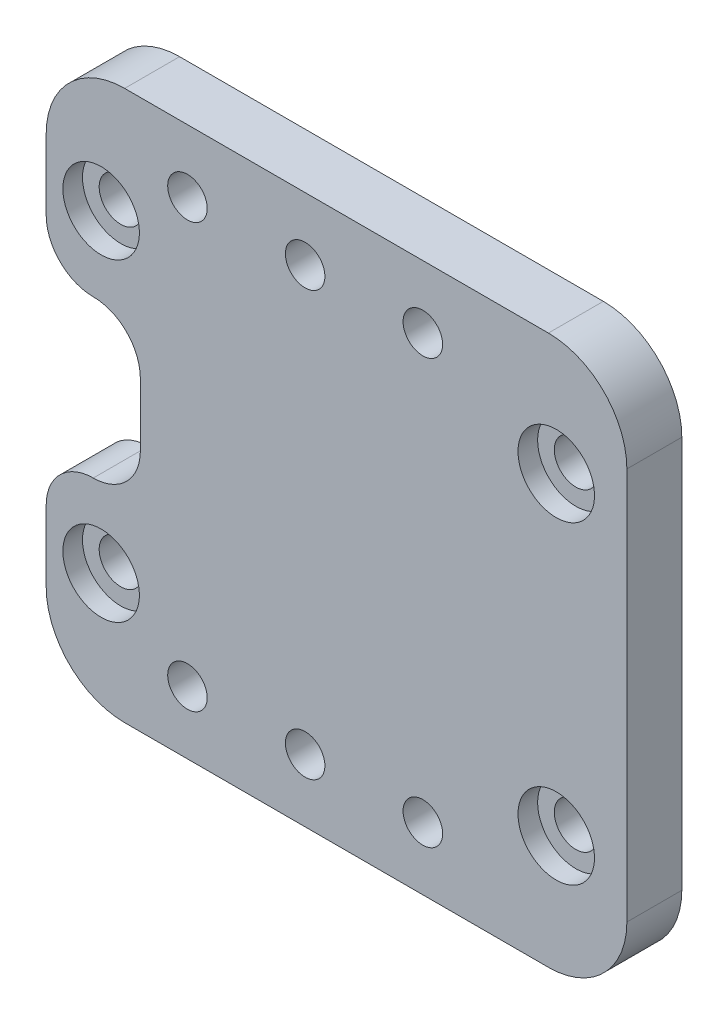
ISO-10303-21;
HEADER;
FILE_DESCRIPTION(('STEP AP214'),'2;1');
FILE_NAME('part.step','',(''),(''),'','','');
FILE_SCHEMA(('AUTOMOTIVE_DESIGN { 1 0 10303 214 1 1 1 1 }'));
ENDSEC;
DATA;
#1=APPLICATION_CONTEXT('core data for automotive mechanical design processes');
#2=APPLICATION_PROTOCOL_DEFINITION('international standard','automotive_design',2000,#1);
#3=PRODUCT_CONTEXT('',#1,'mechanical');
#4=PRODUCT('Part','Part','',(#3));
#5=PRODUCT_RELATED_PRODUCT_CATEGORY('part','',(#4));
#6=PRODUCT_DEFINITION_FORMATION('','',#4);
#7=PRODUCT_DEFINITION_CONTEXT('part definition',#1,'design');
#8=PRODUCT_DEFINITION('design','',#6,#7);
#9=PRODUCT_DEFINITION_SHAPE('','',#8);
#10=(LENGTH_UNIT() NAMED_UNIT(*) SI_UNIT(.MILLI.,.METRE.));
#11=(NAMED_UNIT(*) PLANE_ANGLE_UNIT() SI_UNIT($,.RADIAN.));
#12=(NAMED_UNIT(*) SI_UNIT($,.STERADIAN.) SOLID_ANGLE_UNIT());
#13=UNCERTAINTY_MEASURE_WITH_UNIT(LENGTH_MEASURE(1.E-05),#10,'distance_accuracy_value','');
#14=(GEOMETRIC_REPRESENTATION_CONTEXT(3) GLOBAL_UNCERTAINTY_ASSIGNED_CONTEXT((#13)) GLOBAL_UNIT_ASSIGNED_CONTEXT((#10,
#11,#12)) REPRESENTATION_CONTEXT('',''));
#15=CARTESIAN_POINT('',(0.,0.,0.));
#16=DIRECTION('',(0.,0.,1.));
#17=DIRECTION('',(1.,0.,0.));
#18=AXIS2_PLACEMENT_3D('',#15,#16,#17);
#19=CARTESIAN_POINT('',(269.712072678974,-222.380923975727,0.));
#20=DIRECTION('',(-1.,0.,0.));
#21=DIRECTION('',(0.,0.,1.));
#22=AXIS2_PLACEMENT_3D('',#19,#20,#21);
#23=PLANE('',#22);
#24=DIRECTION('',(0.,0.,1.));
#25=VECTOR('',#24,1.);
#26=CARTESIAN_POINT('',(269.712072678974,-203.380923975727,0.));
#27=LINE('',#26,#25);
#28=CARTESIAN_POINT('',(269.712072678974,-203.380923975727,-7.));
#29=VERTEX_POINT('',#28);
#30=CARTESIAN_POINT('',(269.712072678974,-203.380923975727,0.));
#31=VERTEX_POINT('',#30);
#32=EDGE_CURVE('E279',#29,#31,#27,.T.);
#33=ORIENTED_EDGE('',*,*,#32,.F.);
#34=DIRECTION('',(0.,1.,0.));
#35=VECTOR('',#34,1.);
#36=CARTESIAN_POINT('',(269.712072678974,-222.380923975727,-7.));
#37=LINE('',#36,#35);
#38=CARTESIAN_POINT('',(269.712072678974,-212.380923975727,-7.));
#39=VERTEX_POINT('',#38);
#40=EDGE_CURVE('E262',#39,#29,#37,.T.);
#41=ORIENTED_EDGE('',*,*,#40,.F.);
#42=DIRECTION('',(0.,0.,-1.));
#43=VECTOR('',#42,1.);
#44=CARTESIAN_POINT('',(269.712072678974,-212.380923975727,0.));
#45=LINE('',#44,#43);
#46=CARTESIAN_POINT('',(269.712072678974,-212.380923975727,0.));
#47=VERTEX_POINT('',#46);
#48=EDGE_CURVE('E522',#47,#39,#45,.T.);
#49=ORIENTED_EDGE('',*,*,#48,.F.);
#50=DIRECTION('',(0.,1.,0.));
#51=VECTOR('',#50,1.);
#52=CARTESIAN_POINT('',(269.712072678974,-222.380923975727,0.));
#53=LINE('',#52,#51);
#54=EDGE_CURVE('E278',#47,#31,#53,.T.);
#55=ORIENTED_EDGE('',*,*,#54,.T.);
#56=EDGE_LOOP('',(#33,#41,#49,#55));
#57=FACE_BOUND('',#56,.T.);
#58=ADVANCED_FACE('F17',(#57),#23,.T.);
#59=CARTESIAN_POINT('',(276.712072678974,-207.380923975727,-3.50000000000554));
#60=DIRECTION('',(0.,0.,-1.));
#61=DIRECTION('',(1.,0.,0.));
#62=AXIS2_PLACEMENT_3D('',#59,#60,#61);
#63=CYLINDRICAL_SURFACE('',#62,2.75);
#64=CARTESIAN_POINT('',(276.712072678974,-207.380923975727,-2.50000000000554));
#65=DIRECTION('',(0.,0.,-1.));
#66=DIRECTION('',(1.,0.,0.));
#67=AXIS2_PLACEMENT_3D('',#64,#65,#66);
#68=CIRCLE('',#67,2.75);
#69=CARTESIAN_POINT('',(273.962072678974,-207.380923975727,-2.50000000000554));
#70=VERTEX_POINT('',#69);
#71=EDGE_CURVE('E550',#70,#70,#68,.T.);
#72=ORIENTED_EDGE('',*,*,#71,.F.);
#73=DIRECTION('',(0.,0.,-1.));
#74=VECTOR('',#73,1.);
#75=CARTESIAN_POINT('',(273.962072678974,-207.380923975727,-3.50000000000554));
#76=LINE('',#75,#74);
#77=CARTESIAN_POINT('',(273.962072678974,-207.380923975727,-7.));
#78=VERTEX_POINT('',#77);
#79=EDGE_CURVE('E11',#70,#78,#76,.T.);
#80=ORIENTED_EDGE('',*,*,#79,.T.);
#81=CARTESIAN_POINT('',(276.712072678974,-207.380923975727,-7.));
#82=DIRECTION('',(0.,0.,1.));
#83=DIRECTION('',(1.,0.,0.));
#84=AXIS2_PLACEMENT_3D('',#81,#82,#83);
#85=CIRCLE('',#84,2.75000000000922);
#86=EDGE_CURVE('E274',#78,#78,#85,.T.);
#87=ORIENTED_EDGE('',*,*,#86,.F.);
#88=ORIENTED_EDGE('',*,*,#79,.F.);
#89=EDGE_LOOP('',(#72,#80,#87,#88));
#90=FACE_BOUND('',#89,.T.);
#91=ADVANCED_FACE('F591',(#90),#63,.F.);
#92=CARTESIAN_POINT('',(276.712072678974,-207.380923975727,-1.25000000000554));
#93=DIRECTION('',(0.,0.,-1.));
#94=DIRECTION('',(1.,0.,0.));
#95=AXIS2_PLACEMENT_3D('',#92,#93,#94);
#96=CYLINDRICAL_SURFACE('',#95,4.875);
#97=CARTESIAN_POINT('',(276.712072678974,-207.380923975727,0.));
#98=DIRECTION('',(0.,0.,-1.));
#99=DIRECTION('',(1.,0.,0.));
#100=AXIS2_PLACEMENT_3D('',#97,#98,#99);
#101=CIRCLE('',#100,4.875);
#102=CARTESIAN_POINT('',(271.837072678974,-207.380923975727,0.));
#103=VERTEX_POINT('',#102);
#104=EDGE_CURVE('E358',#103,#103,#101,.T.);
#105=ORIENTED_EDGE('',*,*,#104,.F.);
#106=DIRECTION('',(0.,0.,-1.));
#107=VECTOR('',#106,1.);
#108=CARTESIAN_POINT('',(271.837072678974,-207.380923975727,-1.25000000000554));
#109=LINE('',#108,#107);
#110=CARTESIAN_POINT('',(271.837072678974,-207.380923975727,-2.50000000000554));
#111=VERTEX_POINT('',#110);
#112=EDGE_CURVE('E20',#103,#111,#109,.T.);
#113=ORIENTED_EDGE('',*,*,#112,.T.);
#114=CARTESIAN_POINT('',(276.712072678974,-207.380923975727,-2.50000000000554));
#115=DIRECTION('',(0.,0.,-1.));
#116=DIRECTION('',(1.,0.,0.));
#117=AXIS2_PLACEMENT_3D('',#114,#115,#116);
#118=CIRCLE('',#117,4.875);
#119=EDGE_CURVE('E549',#111,#111,#118,.T.);
#120=ORIENTED_EDGE('',*,*,#119,.T.);
#121=ORIENTED_EDGE('',*,*,#112,.F.);
#122=EDGE_LOOP('',(#105,#113,#120,#121));
#123=FACE_BOUND('',#122,.T.);
#124=ADVANCED_FACE('F574',(#123),#96,.F.);
#125=CARTESIAN_POINT('',(276.712072678974,-207.380923975727,-2.50000000000554));
#126=DIRECTION('',(0.,0.,-1.));
#127=DIRECTION('',(0.,-1.,0.));
#128=AXIS2_PLACEMENT_3D('',#125,#126,#127);
#129=PLANE('',#128);
#130=ORIENTED_EDGE('',*,*,#71,.T.);
#131=EDGE_LOOP('',(#130));
#132=FACE_BOUND('',#131,.T.);
#133=ORIENTED_EDGE('',*,*,#119,.F.);
#134=EDGE_LOOP('',(#133));
#135=FACE_BOUND('',#134,.T.);
#136=ADVANCED_FACE('F580',(#132,#135),#129,.F.);
#137=CARTESIAN_POINT('',(334.712072678974,-167.380923975727,-3.49999999999993));
#138=DIRECTION('',(0.,0.,-1.));
#139=DIRECTION('',(1.,0.,0.));
#140=AXIS2_PLACEMENT_3D('',#137,#138,#139);
#141=CYLINDRICAL_SURFACE('',#140,2.75);
#142=CARTESIAN_POINT('',(334.712072678974,-167.380923975727,-2.49999999999993));
#143=DIRECTION('',(0.,0.,-1.));
#144=DIRECTION('',(1.,0.,0.));
#145=AXIS2_PLACEMENT_3D('',#142,#143,#144);
#146=CIRCLE('',#145,2.75);
#147=CARTESIAN_POINT('',(331.962072678974,-167.380923975727,-2.49999999999993));
#148=VERTEX_POINT('',#147);
#149=EDGE_CURVE('E339',#148,#148,#146,.T.);
#150=ORIENTED_EDGE('',*,*,#149,.F.);
#151=DIRECTION('',(0.,0.,-1.));
#152=VECTOR('',#151,1.);
#153=CARTESIAN_POINT('',(331.962072678974,-167.380923975727,-3.49999999999993));
#154=LINE('',#153,#152);
#155=CARTESIAN_POINT('',(331.962072678974,-167.380923975727,-7.));
#156=VERTEX_POINT('',#155);
#157=EDGE_CURVE('E567',#148,#156,#154,.T.);
#158=ORIENTED_EDGE('',*,*,#157,.T.);
#159=CARTESIAN_POINT('',(334.712072678974,-167.380923975727,-7.));
#160=DIRECTION('',(0.,0.,1.));
#161=DIRECTION('',(1.,0.,0.));
#162=AXIS2_PLACEMENT_3D('',#159,#160,#161);
#163=CIRCLE('',#162,2.74999999999989);
#164=EDGE_CURVE('E385',#156,#156,#163,.T.);
#165=ORIENTED_EDGE('',*,*,#164,.F.);
#166=ORIENTED_EDGE('',*,*,#157,.F.);
#167=EDGE_LOOP('',(#150,#158,#165,#166));
#168=FACE_BOUND('',#167,.T.);
#169=ADVANCED_FACE('F577',(#168),#141,.F.);
#170=CARTESIAN_POINT('',(334.712072678974,-167.380923975727,-1.24999999999993));
#171=DIRECTION('',(0.,0.,-1.));
#172=DIRECTION('',(1.,0.,0.));
#173=AXIS2_PLACEMENT_3D('',#170,#171,#172);
#174=CYLINDRICAL_SURFACE('',#173,4.875);
#175=CARTESIAN_POINT('',(334.712072678974,-167.380923975727,0.));
#176=DIRECTION('',(0.,0.,-1.));
#177=DIRECTION('',(1.,0.,0.));
#178=AXIS2_PLACEMENT_3D('',#175,#176,#177);
#179=CIRCLE('',#178,4.875);
#180=CARTESIAN_POINT('',(329.837072678974,-167.380923975727,0.));
#181=VERTEX_POINT('',#180);
#182=EDGE_CURVE('E352',#181,#181,#179,.T.);
#183=ORIENTED_EDGE('',*,*,#182,.F.);
#184=DIRECTION('',(0.,0.,-1.));
#185=VECTOR('',#184,1.);
#186=CARTESIAN_POINT('',(329.837072678974,-167.380923975727,-1.24999999999993));
#187=LINE('',#186,#185);
#188=CARTESIAN_POINT('',(329.837072678974,-167.380923975727,-2.49999999999993));
#189=VERTEX_POINT('',#188);
#190=EDGE_CURVE('E570',#181,#189,#187,.T.);
#191=ORIENTED_EDGE('',*,*,#190,.T.);
#192=CARTESIAN_POINT('',(334.712072678974,-167.380923975727,-2.49999999999993));
#193=DIRECTION('',(0.,0.,-1.));
#194=DIRECTION('',(1.,0.,0.));
#195=AXIS2_PLACEMENT_3D('',#192,#193,#194);
#196=CIRCLE('',#195,4.875);
#197=EDGE_CURVE('E331',#189,#189,#196,.T.);
#198=ORIENTED_EDGE('',*,*,#197,.T.);
#199=ORIENTED_EDGE('',*,*,#190,.F.);
#200=EDGE_LOOP('',(#183,#191,#198,#199));
#201=FACE_BOUND('',#200,.T.);
#202=ADVANCED_FACE('F586',(#201),#174,.F.);
#203=CARTESIAN_POINT('',(334.712072678974,-167.380923975727,-2.49999999999993));
#204=DIRECTION('',(0.,0.,-1.));
#205=DIRECTION('',(0.,-1.,0.));
#206=AXIS2_PLACEMENT_3D('',#203,#204,#205);
#207=PLANE('',#206);
#208=ORIENTED_EDGE('',*,*,#149,.T.);
#209=EDGE_LOOP('',(#208));
#210=FACE_BOUND('',#209,.T.);
#211=ORIENTED_EDGE('',*,*,#197,.F.);
#212=EDGE_LOOP('',(#211));
#213=FACE_BOUND('',#212,.T.);
#214=ADVANCED_FACE('F706',(#210,#213),#207,.F.);
#215=CARTESIAN_POINT('',(276.712072678974,-167.380923975727,-3.5));
#216=DIRECTION('',(0.,0.,-1.));
#217=DIRECTION('',(1.,0.,0.));
#218=AXIS2_PLACEMENT_3D('',#215,#216,#217);
#219=CYLINDRICAL_SURFACE('',#218,2.75);
#220=CARTESIAN_POINT('',(276.712072678974,-167.380923975727,-2.5));
#221=DIRECTION('',(0.,0.,-1.));
#222=DIRECTION('',(1.,0.,0.));
#223=AXIS2_PLACEMENT_3D('',#220,#221,#222);
#224=CIRCLE('',#223,2.75);
#225=CARTESIAN_POINT('',(273.962072678974,-167.380923975727,-2.5));
#226=VERTEX_POINT('',#225);
#227=EDGE_CURVE('E557',#226,#226,#224,.T.);
#228=ORIENTED_EDGE('',*,*,#227,.F.);
#229=DIRECTION('',(0.,0.,-1.));
#230=VECTOR('',#229,1.);
#231=CARTESIAN_POINT('',(273.962072678974,-167.380923975727,-3.5));
#232=LINE('',#231,#230);
#233=CARTESIAN_POINT('',(273.962072678974,-167.380923975727,-7.));
#234=VERTEX_POINT('',#233);
#235=EDGE_CURVE('E338',#226,#234,#232,.T.);
#236=ORIENTED_EDGE('',*,*,#235,.T.);
#237=CARTESIAN_POINT('',(276.712072678974,-167.380923975727,-7.));
#238=DIRECTION('',(0.,0.,1.));
#239=DIRECTION('',(1.,0.,0.));
#240=AXIS2_PLACEMENT_3D('',#237,#238,#239);
#241=CIRCLE('',#240,2.75);
#242=EDGE_CURVE('E387',#234,#234,#241,.T.);
#243=ORIENTED_EDGE('',*,*,#242,.F.);
#244=ORIENTED_EDGE('',*,*,#235,.F.);
#245=EDGE_LOOP('',(#228,#236,#243,#244));
#246=FACE_BOUND('',#245,.T.);
#247=ADVANCED_FACE('F705',(#246),#219,.F.);
#248=CARTESIAN_POINT('',(276.712072678974,-167.380923975727,-1.25));
#249=DIRECTION('',(0.,0.,-1.));
#250=DIRECTION('',(1.,0.,0.));
#251=AXIS2_PLACEMENT_3D('',#248,#249,#250);
#252=CYLINDRICAL_SURFACE('',#251,4.875);
#253=CARTESIAN_POINT('',(276.712072678974,-167.380923975727,0.));
#254=DIRECTION('',(0.,0.,-1.));
#255=DIRECTION('',(1.,0.,0.));
#256=AXIS2_PLACEMENT_3D('',#253,#254,#255);
#257=CIRCLE('',#256,4.875);
#258=CARTESIAN_POINT('',(271.837072678974,-167.380923975727,0.));
#259=VERTEX_POINT('',#258);
#260=EDGE_CURVE('E360',#259,#259,#257,.T.);
#261=ORIENTED_EDGE('',*,*,#260,.F.);
#262=DIRECTION('',(0.,0.,-1.));
#263=VECTOR('',#262,1.);
#264=CARTESIAN_POINT('',(271.837072678974,-167.380923975727,-1.25));
#265=LINE('',#264,#263);
#266=CARTESIAN_POINT('',(271.837072678974,-167.380923975727,-2.5));
#267=VERTEX_POINT('',#266);
#268=EDGE_CURVE('E482',#259,#267,#265,.T.);
#269=ORIENTED_EDGE('',*,*,#268,.T.);
#270=CARTESIAN_POINT('',(276.712072678974,-167.380923975727,-2.5));
#271=DIRECTION('',(0.,0.,-1.));
#272=DIRECTION('',(1.,0.,0.));
#273=AXIS2_PLACEMENT_3D('',#270,#271,#272);
#274=CIRCLE('',#273,4.875);
#275=EDGE_CURVE('E554',#267,#267,#274,.T.);
#276=ORIENTED_EDGE('',*,*,#275,.T.);
#277=ORIENTED_EDGE('',*,*,#268,.F.);
#278=EDGE_LOOP('',(#261,#269,#276,#277));
#279=FACE_BOUND('',#278,.T.);
#280=ADVANCED_FACE('F696',(#279),#252,.F.);
#281=CARTESIAN_POINT('',(276.712072678974,-167.380923975727,-2.5));
#282=DIRECTION('',(0.,0.,-1.));
#283=DIRECTION('',(0.,-1.,0.));
#284=AXIS2_PLACEMENT_3D('',#281,#282,#283);
#285=PLANE('',#284);
#286=ORIENTED_EDGE('',*,*,#227,.T.);
#287=EDGE_LOOP('',(#286));
#288=FACE_BOUND('',#287,.T.);
#289=ORIENTED_EDGE('',*,*,#275,.F.);
#290=EDGE_LOOP('',(#289));
#291=FACE_BOUND('',#290,.T.);
#292=ADVANCED_FACE('F695',(#288,#291),#285,.F.);
#293=CARTESIAN_POINT('',(334.712072678974,-207.380923975727,-3.50000000000547));
#294=DIRECTION('',(0.,0.,-1.));
#295=DIRECTION('',(1.,0.,0.));
#296=AXIS2_PLACEMENT_3D('',#293,#294,#295);
#297=CYLINDRICAL_SURFACE('',#296,2.75);
#298=CARTESIAN_POINT('',(334.712072678974,-207.380923975727,-2.50000000000547));
#299=DIRECTION('',(0.,0.,-1.));
#300=DIRECTION('',(1.,0.,0.));
#301=AXIS2_PLACEMENT_3D('',#298,#299,#300);
#302=CIRCLE('',#301,2.75);
#303=CARTESIAN_POINT('',(331.962072678974,-207.380923975727,-2.50000000000547));
#304=VERTEX_POINT('',#303);
#305=EDGE_CURVE('E451',#304,#304,#302,.T.);
#306=ORIENTED_EDGE('',*,*,#305,.F.);
#307=DIRECTION('',(0.,0.,-1.));
#308=VECTOR('',#307,1.);
#309=CARTESIAN_POINT('',(331.962072678974,-207.380923975727,-3.50000000000547));
#310=LINE('',#309,#308);
#311=CARTESIAN_POINT('',(331.962072678974,-207.380923975727,-7.));
#312=VERTEX_POINT('',#311);
#313=EDGE_CURVE('E450',#304,#312,#310,.T.);
#314=ORIENTED_EDGE('',*,*,#313,.T.);
#315=CARTESIAN_POINT('',(334.712072678974,-207.380923975727,-7.));
#316=DIRECTION('',(0.,0.,1.));
#317=DIRECTION('',(1.,0.,0.));
#318=AXIS2_PLACEMENT_3D('',#315,#316,#317);
#319=CIRCLE('',#318,2.75000000000911);
#320=EDGE_CURVE('E388',#312,#312,#319,.T.);
#321=ORIENTED_EDGE('',*,*,#320,.F.);
#322=ORIENTED_EDGE('',*,*,#313,.F.);
#323=EDGE_LOOP('',(#306,#314,#321,#322));
#324=FACE_BOUND('',#323,.T.);
#325=ADVANCED_FACE('F675',(#324),#297,.F.);
#326=CARTESIAN_POINT('',(334.712072678974,-207.380923975727,-1.25000000000547));
#327=DIRECTION('',(0.,0.,-1.));
#328=DIRECTION('',(1.,0.,0.));
#329=AXIS2_PLACEMENT_3D('',#326,#327,#328);
#330=CYLINDRICAL_SURFACE('',#329,4.875);
#331=CARTESIAN_POINT('',(334.712072678974,-207.380923975727,0.));
#332=DIRECTION('',(0.,0.,-1.));
#333=DIRECTION('',(1.,0.,0.));
#334=AXIS2_PLACEMENT_3D('',#331,#332,#333);
#335=CIRCLE('',#334,4.875);
#336=CARTESIAN_POINT('',(329.837072678974,-207.380923975727,0.));
#337=VERTEX_POINT('',#336);
#338=EDGE_CURVE('E297',#337,#337,#335,.T.);
#339=ORIENTED_EDGE('',*,*,#338,.F.);
#340=DIRECTION('',(0.,0.,-1.));
#341=VECTOR('',#340,1.);
#342=CARTESIAN_POINT('',(329.837072678974,-207.380923975727,-1.25000000000547));
#343=LINE('',#342,#341);
#344=CARTESIAN_POINT('',(329.837072678974,-207.380923975727,-2.50000000000547));
#345=VERTEX_POINT('',#344);
#346=EDGE_CURVE('E447',#337,#345,#343,.T.);
#347=ORIENTED_EDGE('',*,*,#346,.T.);
#348=CARTESIAN_POINT('',(334.712072678974,-207.380923975727,-2.50000000000547));
#349=DIRECTION('',(0.,0.,-1.));
#350=DIRECTION('',(1.,0.,0.));
#351=AXIS2_PLACEMENT_3D('',#348,#349,#350);
#352=CIRCLE('',#351,4.875);
#353=EDGE_CURVE('E539',#345,#345,#352,.T.);
#354=ORIENTED_EDGE('',*,*,#353,.T.);
#355=ORIENTED_EDGE('',*,*,#346,.F.);
#356=EDGE_LOOP('',(#339,#347,#354,#355));
#357=FACE_BOUND('',#356,.T.);
#358=ADVANCED_FACE('F669',(#357),#330,.F.);
#359=CARTESIAN_POINT('',(334.712072678974,-207.380923975727,-2.50000000000547));
#360=DIRECTION('',(0.,0.,-1.));
#361=DIRECTION('',(0.,-1.,0.));
#362=AXIS2_PLACEMENT_3D('',#359,#360,#361);
#363=PLANE('',#362);
#364=ORIENTED_EDGE('',*,*,#305,.T.);
#365=EDGE_LOOP('',(#364));
#366=FACE_BOUND('',#365,.T.);
#367=ORIENTED_EDGE('',*,*,#353,.F.);
#368=EDGE_LOOP('',(#367));
#369=FACE_BOUND('',#368,.T.);
#370=ADVANCED_FACE('F671',(#366,#369),#363,.F.);
#371=CARTESIAN_POINT('',(317.712072678974,-214.380923975727,-3.5));
#372=DIRECTION('',(0.,0.,-1.));
#373=DIRECTION('',(1.,0.,0.));
#374=AXIS2_PLACEMENT_3D('',#371,#372,#373);
#375=CYLINDRICAL_SURFACE('',#374,2.5175);
#376=CARTESIAN_POINT('',(317.712072678974,-214.380923975727,0.));
#377=DIRECTION('',(0.,0.,-1.));
#378=DIRECTION('',(1.,0.,0.));
#379=AXIS2_PLACEMENT_3D('',#376,#377,#378);
#380=CIRCLE('',#379,2.5175);
#381=CARTESIAN_POINT('',(315.194572678974,-214.380923975727,0.));
#382=VERTEX_POINT('',#381);
#383=EDGE_CURVE('E499',#382,#382,#380,.T.);
#384=ORIENTED_EDGE('',*,*,#383,.F.);
#385=DIRECTION('',(0.,0.,-1.));
#386=VECTOR('',#385,1.);
#387=CARTESIAN_POINT('',(315.194572678974,-214.380923975727,-3.5));
#388=LINE('',#387,#386);
#389=CARTESIAN_POINT('',(315.194572678974,-214.380923975727,-7.));
#390=VERTEX_POINT('',#389);
#391=EDGE_CURVE('E531',#382,#390,#388,.T.);
#392=ORIENTED_EDGE('',*,*,#391,.T.);
#393=CARTESIAN_POINT('',(317.712072678974,-214.380923975727,-7.));
#394=DIRECTION('',(0.,0.,1.));
#395=DIRECTION('',(1.,0.,0.));
#396=AXIS2_PLACEMENT_3D('',#393,#394,#395);
#397=CIRCLE('',#396,2.5175);
#398=EDGE_CURVE('E399',#390,#390,#397,.T.);
#399=ORIENTED_EDGE('',*,*,#398,.F.);
#400=ORIENTED_EDGE('',*,*,#391,.F.);
#401=EDGE_LOOP('',(#384,#392,#399,#400));
#402=FACE_BOUND('',#401,.T.);
#403=ADVANCED_FACE('F683',(#402),#375,.F.);
#404=CARTESIAN_POINT('',(287.712072678974,-214.380923975727,-3.5));
#405=DIRECTION('',(0.,0.,-1.));
#406=DIRECTION('',(1.,0.,0.));
#407=AXIS2_PLACEMENT_3D('',#404,#405,#406);
#408=CYLINDRICAL_SURFACE('',#407,2.5175);
#409=CARTESIAN_POINT('',(287.712072678974,-214.380923975727,0.));
#410=DIRECTION('',(0.,0.,-1.));
#411=DIRECTION('',(1.,0.,0.));
#412=AXIS2_PLACEMENT_3D('',#409,#410,#411);
#413=CIRCLE('',#412,2.5175);
#414=CARTESIAN_POINT('',(285.194572678974,-214.380923975727,0.));
#415=VERTEX_POINT('',#414);
#416=EDGE_CURVE('E396',#415,#415,#413,.T.);
#417=ORIENTED_EDGE('',*,*,#416,.F.);
#418=DIRECTION('',(0.,0.,-1.));
#419=VECTOR('',#418,1.);
#420=CARTESIAN_POINT('',(285.194572678974,-214.380923975727,-3.5));
#421=LINE('',#420,#419);
#422=CARTESIAN_POINT('',(285.194572678974,-214.380923975727,-7.));
#423=VERTEX_POINT('',#422);
#424=EDGE_CURVE('E306',#415,#423,#421,.T.);
#425=ORIENTED_EDGE('',*,*,#424,.T.);
#426=CARTESIAN_POINT('',(287.712072678974,-214.380923975727,-7.));
#427=DIRECTION('',(0.,0.,1.));
#428=DIRECTION('',(1.,0.,0.));
#429=AXIS2_PLACEMENT_3D('',#426,#427,#428);
#430=CIRCLE('',#429,2.5175);
#431=EDGE_CURVE('E402',#423,#423,#430,.T.);
#432=ORIENTED_EDGE('',*,*,#431,.F.);
#433=ORIENTED_EDGE('',*,*,#424,.F.);
#434=EDGE_LOOP('',(#417,#425,#432,#433));
#435=FACE_BOUND('',#434,.T.);
#436=ADVANCED_FACE('F679',(#435),#408,.F.);
#437=CARTESIAN_POINT('',(302.712072678974,-160.380923975727,-3.5));
#438=DIRECTION('',(0.,0.,-1.));
#439=DIRECTION('',(1.,0.,0.));
#440=AXIS2_PLACEMENT_3D('',#437,#438,#439);
#441=CYLINDRICAL_SURFACE('',#440,2.5175);
#442=CARTESIAN_POINT('',(302.712072678974,-160.380923975727,0.));
#443=DIRECTION('',(0.,0.,-1.));
#444=DIRECTION('',(1.,0.,0.));
#445=AXIS2_PLACEMENT_3D('',#442,#443,#444);
#446=CIRCLE('',#445,2.5175);
#447=CARTESIAN_POINT('',(300.194572678974,-160.380923975727,0.));
#448=VERTEX_POINT('',#447);
#449=EDGE_CURVE('E391',#448,#448,#446,.T.);
#450=ORIENTED_EDGE('',*,*,#449,.F.);
#451=DIRECTION('',(0.,0.,-1.));
#452=VECTOR('',#451,1.);
#453=CARTESIAN_POINT('',(300.194572678974,-160.380923975727,-3.5));
#454=LINE('',#453,#452);
#455=CARTESIAN_POINT('',(300.194572678974,-160.380923975727,-7.));
#456=VERTEX_POINT('',#455);
#457=EDGE_CURVE('E304',#448,#456,#454,.T.);
#458=ORIENTED_EDGE('',*,*,#457,.T.);
#459=CARTESIAN_POINT('',(302.712072678974,-160.380923975727,-7.));
#460=DIRECTION('',(0.,0.,1.));
#461=DIRECTION('',(1.,0.,0.));
#462=AXIS2_PLACEMENT_3D('',#459,#460,#461);
#463=CIRCLE('',#462,2.5175);
#464=EDGE_CURVE('E407',#456,#456,#463,.T.);
#465=ORIENTED_EDGE('',*,*,#464,.F.);
#466=ORIENTED_EDGE('',*,*,#457,.F.);
#467=EDGE_LOOP('',(#450,#458,#465,#466));
#468=FACE_BOUND('',#467,.T.);
#469=ADVANCED_FACE('F680',(#468),#441,.F.);
#470=CARTESIAN_POINT('',(287.712072678974,-160.380923975727,-3.5));
#471=DIRECTION('',(0.,0.,-1.));
#472=DIRECTION('',(1.,0.,0.));
#473=AXIS2_PLACEMENT_3D('',#470,#471,#472);
#474=CYLINDRICAL_SURFACE('',#473,2.5175);
#475=CARTESIAN_POINT('',(287.712072678974,-160.380923975727,0.));
#476=DIRECTION('',(0.,0.,-1.));
#477=DIRECTION('',(1.,0.,0.));
#478=AXIS2_PLACEMENT_3D('',#475,#476,#477);
#479=CIRCLE('',#478,2.5175);
#480=CARTESIAN_POINT('',(285.194572678974,-160.380923975727,0.));
#481=VERTEX_POINT('',#480);
#482=EDGE_CURVE('E395',#481,#481,#479,.T.);
#483=ORIENTED_EDGE('',*,*,#482,.F.);
#484=DIRECTION('',(0.,0.,-1.));
#485=VECTOR('',#484,1.);
#486=CARTESIAN_POINT('',(285.194572678974,-160.380923975727,-3.5));
#487=LINE('',#486,#485);
#488=CARTESIAN_POINT('',(285.194572678974,-160.380923975727,-7.));
#489=VERTEX_POINT('',#488);
#490=EDGE_CURVE('E310',#481,#489,#487,.T.);
#491=ORIENTED_EDGE('',*,*,#490,.T.);
#492=CARTESIAN_POINT('',(287.712072678974,-160.380923975727,-7.));
#493=DIRECTION('',(0.,0.,1.));
#494=DIRECTION('',(1.,0.,0.));
#495=AXIS2_PLACEMENT_3D('',#492,#493,#494);
#496=CIRCLE('',#495,2.5175);
#497=EDGE_CURVE('E415',#489,#489,#496,.T.);
#498=ORIENTED_EDGE('',*,*,#497,.F.);
#499=ORIENTED_EDGE('',*,*,#490,.F.);
#500=EDGE_LOOP('',(#483,#491,#498,#499));
#501=FACE_BOUND('',#500,.T.);
#502=ADVANCED_FACE('F666',(#501),#474,.F.);
#503=CARTESIAN_POINT('',(302.712072678974,-214.380923975727,-3.5));
#504=DIRECTION('',(0.,0.,-1.));
#505=DIRECTION('',(1.,0.,0.));
#506=AXIS2_PLACEMENT_3D('',#503,#504,#505);
#507=CYLINDRICAL_SURFACE('',#506,2.5175);
#508=CARTESIAN_POINT('',(302.712072678974,-214.380923975727,0.));
#509=DIRECTION('',(0.,0.,-1.));
#510=DIRECTION('',(1.,0.,0.));
#511=AXIS2_PLACEMENT_3D('',#508,#509,#510);
#512=CIRCLE('',#511,2.5175);
#513=CARTESIAN_POINT('',(300.194572678974,-214.380923975727,0.));
#514=VERTEX_POINT('',#513);
#515=EDGE_CURVE('E326',#514,#514,#512,.T.);
#516=ORIENTED_EDGE('',*,*,#515,.F.);
#517=DIRECTION('',(0.,0.,-1.));
#518=VECTOR('',#517,1.);
#519=CARTESIAN_POINT('',(300.194572678974,-214.380923975727,-3.5));
#520=LINE('',#519,#518);
#521=CARTESIAN_POINT('',(300.194572678974,-214.380923975727,-7.));
#522=VERTEX_POINT('',#521);
#523=EDGE_CURVE('E529',#514,#522,#520,.T.);
#524=ORIENTED_EDGE('',*,*,#523,.T.);
#525=CARTESIAN_POINT('',(302.712072678974,-214.380923975727,-7.));
#526=DIRECTION('',(0.,0.,1.));
#527=DIRECTION('',(1.,0.,0.));
#528=AXIS2_PLACEMENT_3D('',#525,#526,#527);
#529=CIRCLE('',#528,2.5175);
#530=EDGE_CURVE('E418',#522,#522,#529,.T.);
#531=ORIENTED_EDGE('',*,*,#530,.F.);
#532=ORIENTED_EDGE('',*,*,#523,.F.);
#533=EDGE_LOOP('',(#516,#524,#531,#532));
#534=FACE_BOUND('',#533,.T.);
#535=ADVANCED_FACE('F665',(#534),#507,.F.);
#536=CARTESIAN_POINT('',(317.712072678974,-160.380923975727,-3.5));
#537=DIRECTION('',(0.,0.,-1.));
#538=DIRECTION('',(1.,0.,0.));
#539=AXIS2_PLACEMENT_3D('',#536,#537,#538);
#540=CYLINDRICAL_SURFACE('',#539,2.5175);
#541=CARTESIAN_POINT('',(317.712072678974,-160.380923975727,0.));
#542=DIRECTION('',(0.,0.,-1.));
#543=DIRECTION('',(1.,0.,0.));
#544=AXIS2_PLACEMENT_3D('',#541,#542,#543);
#545=CIRCLE('',#544,2.5175);
#546=CARTESIAN_POINT('',(315.194572678974,-160.380923975727,0.));
#547=VERTEX_POINT('',#546);
#548=EDGE_CURVE('E321',#547,#547,#545,.T.);
#549=ORIENTED_EDGE('',*,*,#548,.F.);
#550=DIRECTION('',(0.,0.,-1.));
#551=VECTOR('',#550,1.);
#552=CARTESIAN_POINT('',(315.194572678974,-160.380923975727,-3.5));
#553=LINE('',#552,#551);
#554=CARTESIAN_POINT('',(315.194572678974,-160.380923975727,-7.));
#555=VERTEX_POINT('',#554);
#556=EDGE_CURVE('E527',#547,#555,#553,.T.);
#557=ORIENTED_EDGE('',*,*,#556,.T.);
#558=CARTESIAN_POINT('',(317.712072678974,-160.380923975727,-7.));
#559=DIRECTION('',(0.,0.,1.));
#560=DIRECTION('',(1.,0.,0.));
#561=AXIS2_PLACEMENT_3D('',#558,#559,#560);
#562=CIRCLE('',#561,2.5175);
#563=EDGE_CURVE('E419',#555,#555,#562,.T.);
#564=ORIENTED_EDGE('',*,*,#563,.F.);
#565=ORIENTED_EDGE('',*,*,#556,.F.);
#566=EDGE_LOOP('',(#549,#557,#564,#565));
#567=FACE_BOUND('',#566,.T.);
#568=ADVANCED_FACE('F658',(#567),#540,.F.);
#569=CARTESIAN_POINT('',(279.712072678974,-212.380923975727,0.));
#570=DIRECTION('',(0.,0.,-1.));
#571=DIRECTION('',(-0.707106781186548,-0.707106781186548,0.));
#572=AXIS2_PLACEMENT_3D('',#569,#570,#571);
#573=CYLINDRICAL_SURFACE('',#572,10.);
#574=CARTESIAN_POINT('',(279.712072678974,-212.380923975727,-7.));
#575=DIRECTION('',(0.,0.,1.));
#576=DIRECTION('',(-0.707106781186548,-0.707106781186548,0.));
#577=AXIS2_PLACEMENT_3D('',#574,#575,#576);
#578=CIRCLE('',#577,10.);
#579=CARTESIAN_POINT('',(279.712072678974,-222.380923975727,-7.));
#580=VERTEX_POINT('',#579);
#581=EDGE_CURVE('E275',#39,#580,#578,.T.);
#582=ORIENTED_EDGE('',*,*,#581,.T.);
#583=DIRECTION('',(0.,0.,1.));
#584=VECTOR('',#583,1.);
#585=CARTESIAN_POINT('',(279.712072678974,-222.380923975727,0.));
#586=LINE('',#585,#584);
#587=CARTESIAN_POINT('',(279.712072678974,-222.380923975727,0.));
#588=VERTEX_POINT('',#587);
#589=EDGE_CURVE('E521',#580,#588,#586,.T.);
#590=ORIENTED_EDGE('',*,*,#589,.T.);
#591=CARTESIAN_POINT('',(279.712072678974,-212.380923975727,0.));
#592=DIRECTION('',(0.,0.,-1.));
#593=DIRECTION('',(-0.707106781186548,-0.707106781186548,0.));
#594=AXIS2_PLACEMENT_3D('',#591,#592,#593);
#595=CIRCLE('',#594,10.);
#596=EDGE_CURVE('E465',#588,#47,#595,.T.);
#597=ORIENTED_EDGE('',*,*,#596,.T.);
#598=ORIENTED_EDGE('',*,*,#48,.T.);
#599=EDGE_LOOP('',(#582,#590,#597,#598));
#600=FACE_BOUND('',#599,.T.);
#601=ADVANCED_FACE('F651',(#600),#573,.T.);
#602=CARTESIAN_POINT('',(343.712072678974,-222.380923975727,0.));
#603=DIRECTION('',(0.,-1.,0.));
#604=DIRECTION('',(0.,0.,-1.));
#605=AXIS2_PLACEMENT_3D('',#602,#603,#604);
#606=PLANE('',#605);
#607=DIRECTION('',(0.,0.,-1.));
#608=VECTOR('',#607,1.);
#609=CARTESIAN_POINT('',(333.712072678974,-222.380923975727,0.));
#610=LINE('',#609,#608);
#611=CARTESIAN_POINT('',(333.712072678974,-222.380923975727,0.));
#612=VERTEX_POINT('',#611);
#613=CARTESIAN_POINT('',(333.712072678974,-222.380923975727,-7.));
#614=VERTEX_POINT('',#613);
#615=EDGE_CURVE('E517',#612,#614,#610,.T.);
#616=ORIENTED_EDGE('',*,*,#615,.F.);
#617=DIRECTION('',(-1.,0.,0.));
#618=VECTOR('',#617,1.);
#619=CARTESIAN_POINT('',(343.712072678974,-222.380923975727,0.));
#620=LINE('',#619,#618);
#621=EDGE_CURVE('E466',#612,#588,#620,.T.);
#622=ORIENTED_EDGE('',*,*,#621,.T.);
#623=ORIENTED_EDGE('',*,*,#589,.F.);
#624=DIRECTION('',(-1.,0.,0.));
#625=VECTOR('',#624,1.);
#626=CARTESIAN_POINT('',(343.712072678974,-222.380923975727,-7.));
#627=LINE('',#626,#625);
#628=EDGE_CURVE('E372',#614,#580,#627,.T.);
#629=ORIENTED_EDGE('',*,*,#628,.F.);
#630=EDGE_LOOP('',(#616,#622,#623,#629));
#631=FACE_BOUND('',#630,.T.);
#632=ADVANCED_FACE('F650',(#631),#606,.T.);
#633=CARTESIAN_POINT('',(333.712072678974,-212.380923975727,0.));
#634=DIRECTION('',(0.,0.,-1.));
#635=DIRECTION('',(0.707106781186548,-0.707106781186548,0.));
#636=AXIS2_PLACEMENT_3D('',#633,#634,#635);
#637=CYLINDRICAL_SURFACE('',#636,10.);
#638=CARTESIAN_POINT('',(333.712072678974,-212.380923975727,-7.));
#639=DIRECTION('',(0.,0.,1.));
#640=DIRECTION('',(0.707106781186548,-0.707106781186548,0.));
#641=AXIS2_PLACEMENT_3D('',#638,#639,#640);
#642=CIRCLE('',#641,10.);
#643=CARTESIAN_POINT('',(343.712072678974,-212.380923975727,-7.));
#644=VERTEX_POINT('',#643);
#645=EDGE_CURVE('E342',#614,#644,#642,.T.);
#646=ORIENTED_EDGE('',*,*,#645,.T.);
#647=DIRECTION('',(0.,0.,1.));
#648=VECTOR('',#647,1.);
#649=CARTESIAN_POINT('',(343.712072678974,-212.380923975727,0.));
#650=LINE('',#649,#648);
#651=CARTESIAN_POINT('',(343.712072678974,-212.380923975727,0.));
#652=VERTEX_POINT('',#651);
#653=EDGE_CURVE('E514',#644,#652,#650,.T.);
#654=ORIENTED_EDGE('',*,*,#653,.T.);
#655=CARTESIAN_POINT('',(333.712072678974,-212.380923975727,0.));
#656=DIRECTION('',(0.,0.,-1.));
#657=DIRECTION('',(0.707106781186548,-0.707106781186548,0.));
#658=AXIS2_PLACEMENT_3D('',#655,#656,#657);
#659=CIRCLE('',#658,10.);
#660=EDGE_CURVE('E469',#652,#612,#659,.T.);
#661=ORIENTED_EDGE('',*,*,#660,.T.);
#662=ORIENTED_EDGE('',*,*,#615,.T.);
#663=EDGE_LOOP('',(#646,#654,#661,#662));
#664=FACE_BOUND('',#663,.T.);
#665=ADVANCED_FACE('F649',(#664),#637,.T.);
#666=CARTESIAN_POINT('',(343.712072678974,-152.380923975727,0.));
#667=DIRECTION('',(1.,0.,0.));
#668=DIRECTION('',(0.,1.,0.));
#669=AXIS2_PLACEMENT_3D('',#666,#667,#668);
#670=PLANE('',#669);
#671=DIRECTION('',(0.,0.,-1.));
#672=VECTOR('',#671,1.);
#673=CARTESIAN_POINT('',(343.712072678974,-162.380923975727,0.));
#674=LINE('',#673,#672);
#675=CARTESIAN_POINT('',(343.712072678974,-162.380923975727,0.));
#676=VERTEX_POINT('',#675);
#677=CARTESIAN_POINT('',(343.712072678974,-162.380923975727,-7.));
#678=VERTEX_POINT('',#677);
#679=EDGE_CURVE('E491',#676,#678,#674,.T.);
#680=ORIENTED_EDGE('',*,*,#679,.F.);
#681=DIRECTION('',(0.,-1.,0.));
#682=VECTOR('',#681,1.);
#683=CARTESIAN_POINT('',(343.712072678974,-152.380923975727,0.));
#684=LINE('',#683,#682);
#685=EDGE_CURVE('E475',#676,#652,#684,.T.);
#686=ORIENTED_EDGE('',*,*,#685,.T.);
#687=ORIENTED_EDGE('',*,*,#653,.F.);
#688=DIRECTION('',(0.,-1.,0.));
#689=VECTOR('',#688,1.);
#690=CARTESIAN_POINT('',(343.712072678974,-152.380923975727,-7.));
#691=LINE('',#690,#689);
#692=EDGE_CURVE('E340',#678,#644,#691,.T.);
#693=ORIENTED_EDGE('',*,*,#692,.F.);
#694=EDGE_LOOP('',(#680,#686,#687,#693));
#695=FACE_BOUND('',#694,.T.);
#696=ADVANCED_FACE('F638',(#695),#670,.T.);
#697=CARTESIAN_POINT('',(333.712072678974,-162.380923975727,0.));
#698=DIRECTION('',(0.,0.,-1.));
#699=DIRECTION('',(0.707106781186548,0.707106781186548,0.));
#700=AXIS2_PLACEMENT_3D('',#697,#698,#699);
#701=CYLINDRICAL_SURFACE('',#700,10.);
#702=CARTESIAN_POINT('',(333.712072678974,-162.380923975727,-7.));
#703=DIRECTION('',(0.,0.,1.));
#704=DIRECTION('',(0.707106781186548,0.707106781186548,0.));
#705=AXIS2_PLACEMENT_3D('',#702,#703,#704);
#706=CIRCLE('',#705,10.);
#707=CARTESIAN_POINT('',(333.712072678974,-152.380923975727,-7.));
#708=VERTEX_POINT('',#707);
#709=EDGE_CURVE('E344',#678,#708,#706,.T.);
#710=ORIENTED_EDGE('',*,*,#709,.T.);
#711=DIRECTION('',(0.,0.,1.));
#712=VECTOR('',#711,1.);
#713=CARTESIAN_POINT('',(333.712072678974,-152.380923975727,0.));
#714=LINE('',#713,#712);
#715=CARTESIAN_POINT('',(333.712072678974,-152.380923975727,0.));
#716=VERTEX_POINT('',#715);
#717=EDGE_CURVE('E488',#708,#716,#714,.T.);
#718=ORIENTED_EDGE('',*,*,#717,.T.);
#719=CARTESIAN_POINT('',(333.712072678974,-162.380923975727,0.));
#720=DIRECTION('',(0.,0.,-1.));
#721=DIRECTION('',(0.707106781186548,0.707106781186548,0.));
#722=AXIS2_PLACEMENT_3D('',#719,#720,#721);
#723=CIRCLE('',#722,10.);
#724=EDGE_CURVE('E476',#716,#676,#723,.T.);
#725=ORIENTED_EDGE('',*,*,#724,.T.);
#726=ORIENTED_EDGE('',*,*,#679,.T.);
#727=EDGE_LOOP('',(#710,#718,#725,#726));
#728=FACE_BOUND('',#727,.T.);
#729=ADVANCED_FACE('F627',(#728),#701,.T.);
#730=CARTESIAN_POINT('',(269.712072678974,-152.380923975727,0.));
#731=DIRECTION('',(0.,1.,0.));
#732=DIRECTION('',(1.,0.,0.));
#733=AXIS2_PLACEMENT_3D('',#730,#731,#732);
#734=PLANE('',#733);
#735=DIRECTION('',(0.,0.,-1.));
#736=VECTOR('',#735,1.);
#737=CARTESIAN_POINT('',(279.712072678974,-152.380923975727,0.));
#738=LINE('',#737,#736);
#739=CARTESIAN_POINT('',(279.712072678974,-152.380923975727,0.));
#740=VERTEX_POINT('',#739);
#741=CARTESIAN_POINT('',(279.712072678974,-152.380923975727,-7.));
#742=VERTEX_POINT('',#741);
#743=EDGE_CURVE('E324',#740,#742,#738,.T.);
#744=ORIENTED_EDGE('',*,*,#743,.F.);
#745=DIRECTION('',(1.,0.,0.));
#746=VECTOR('',#745,1.);
#747=CARTESIAN_POINT('',(269.712072678974,-152.380923975727,0.));
#748=LINE('',#747,#746);
#749=EDGE_CURVE('E428',#740,#716,#748,.T.);
#750=ORIENTED_EDGE('',*,*,#749,.T.);
#751=ORIENTED_EDGE('',*,*,#717,.F.);
#752=DIRECTION('',(1.,0.,0.));
#753=VECTOR('',#752,1.);
#754=CARTESIAN_POINT('',(269.712072678974,-152.380923975727,-7.));
#755=LINE('',#754,#753);
#756=EDGE_CURVE('E329',#742,#708,#755,.T.);
#757=ORIENTED_EDGE('',*,*,#756,.F.);
#758=EDGE_LOOP('',(#744,#750,#751,#757));
#759=FACE_BOUND('',#758,.T.);
#760=ADVANCED_FACE('F622',(#759),#734,.T.);
#761=CARTESIAN_POINT('',(279.712072678974,-162.380923975727,0.));
#762=DIRECTION('',(0.,0.,-1.));
#763=DIRECTION('',(-0.707106781186548,0.707106781186548,0.));
#764=AXIS2_PLACEMENT_3D('',#761,#762,#763);
#765=CYLINDRICAL_SURFACE('',#764,10.);
#766=CARTESIAN_POINT('',(279.712072678974,-162.380923975727,-7.));
#767=DIRECTION('',(0.,0.,1.));
#768=DIRECTION('',(-0.707106781186548,0.707106781186548,0.));
#769=AXIS2_PLACEMENT_3D('',#766,#767,#768);
#770=CIRCLE('',#769,10.);
#771=CARTESIAN_POINT('',(269.712072678974,-162.380923975727,-7.));
#772=VERTEX_POINT('',#771);
#773=EDGE_CURVE('E314',#742,#772,#770,.T.);
#774=ORIENTED_EDGE('',*,*,#773,.T.);
#775=DIRECTION('',(0.,0.,1.));
#776=VECTOR('',#775,1.);
#777=CARTESIAN_POINT('',(269.712072678974,-162.380923975727,0.));
#778=LINE('',#777,#776);
#779=CARTESIAN_POINT('',(269.712072678974,-162.380923975727,0.));
#780=VERTEX_POINT('',#779);
#781=EDGE_CURVE('E369',#772,#780,#778,.T.);
#782=ORIENTED_EDGE('',*,*,#781,.T.);
#783=CARTESIAN_POINT('',(279.712072678974,-162.380923975727,0.));
#784=DIRECTION('',(0.,0.,-1.));
#785=DIRECTION('',(-0.707106781186548,0.707106781186548,0.));
#786=AXIS2_PLACEMENT_3D('',#783,#784,#785);
#787=CIRCLE('',#786,10.);
#788=EDGE_CURVE('E424',#780,#740,#787,.T.);
#789=ORIENTED_EDGE('',*,*,#788,.T.);
#790=ORIENTED_EDGE('',*,*,#743,.T.);
#791=EDGE_LOOP('',(#774,#782,#789,#790));
#792=FACE_BOUND('',#791,.T.);
#793=ADVANCED_FACE('F630',(#792),#765,.T.);
#794=CARTESIAN_POINT('',(306.712072678974,-187.380923975727,0.));
#795=DIRECTION('',(0.,0.,1.));
#796=DIRECTION('',(1.,0.,0.));
#797=AXIS2_PLACEMENT_3D('',#794,#795,#796);
#798=PLANE('',#797);
#799=ORIENTED_EDGE('',*,*,#548,.T.);
#800=EDGE_LOOP('',(#799));
#801=FACE_BOUND('',#800,.T.);
#802=ORIENTED_EDGE('',*,*,#515,.T.);
#803=EDGE_LOOP('',(#802));
#804=FACE_BOUND('',#803,.T.);
#805=ORIENTED_EDGE('',*,*,#482,.T.);
#806=EDGE_LOOP('',(#805));
#807=FACE_BOUND('',#806,.T.);
#808=ORIENTED_EDGE('',*,*,#449,.T.);
#809=EDGE_LOOP('',(#808));
#810=FACE_BOUND('',#809,.T.);
#811=ORIENTED_EDGE('',*,*,#416,.T.);
#812=EDGE_LOOP('',(#811));
#813=FACE_BOUND('',#812,.T.);
#814=ORIENTED_EDGE('',*,*,#383,.T.);
#815=EDGE_LOOP('',(#814));
#816=FACE_BOUND('',#815,.T.);
#817=ORIENTED_EDGE('',*,*,#338,.T.);
#818=EDGE_LOOP('',(#817));
#819=FACE_BOUND('',#818,.T.);
#820=ORIENTED_EDGE('',*,*,#260,.T.);
#821=EDGE_LOOP('',(#820));
#822=FACE_BOUND('',#821,.T.);
#823=ORIENTED_EDGE('',*,*,#182,.T.);
#824=EDGE_LOOP('',(#823));
#825=FACE_BOUND('',#824,.T.);
#826=ORIENTED_EDGE('',*,*,#104,.T.);
#827=EDGE_LOOP('',(#826));
#828=FACE_BOUND('',#827,.T.);
#829=CARTESIAN_POINT('',(275.712072678974,-203.380923975727,0.));
#830=DIRECTION('',(0.,0.,-1.));
#831=DIRECTION('',(-0.707106781186552,0.707106781186543,0.));
#832=AXIS2_PLACEMENT_3D('',#829,#830,#831);
#833=CIRCLE('',#832,6.);
#834=CARTESIAN_POINT('',(275.712072678974,-197.380923975727,0.));
#835=VERTEX_POINT('',#834);
#836=EDGE_CURVE('E285',#31,#835,#833,.T.);
#837=ORIENTED_EDGE('',*,*,#836,.F.);
#838=ORIENTED_EDGE('',*,*,#54,.F.);
#839=ORIENTED_EDGE('',*,*,#596,.F.);
#840=ORIENTED_EDGE('',*,*,#621,.F.);
#841=ORIENTED_EDGE('',*,*,#660,.F.);
#842=ORIENTED_EDGE('',*,*,#685,.F.);
#843=ORIENTED_EDGE('',*,*,#724,.F.);
#844=ORIENTED_EDGE('',*,*,#749,.F.);
#845=ORIENTED_EDGE('',*,*,#788,.F.);
#846=DIRECTION('',(0.,1.,0.));
#847=VECTOR('',#846,1.);
#848=CARTESIAN_POINT('',(269.712072678974,-222.380923975727,0.));
#849=LINE('',#848,#847);
#850=CARTESIAN_POINT('',(269.712072678974,-171.380923975727,0.));
#851=VERTEX_POINT('',#850);
#852=EDGE_CURVE('E364',#851,#780,#849,.T.);
#853=ORIENTED_EDGE('',*,*,#852,.F.);
#854=CARTESIAN_POINT('',(275.712072678974,-171.380923975727,0.));
#855=DIRECTION('',(0.,0.,-1.));
#856=DIRECTION('',(-0.707106781186548,-0.707106781186548,0.));
#857=AXIS2_PLACEMENT_3D('',#854,#855,#856);
#858=CIRCLE('',#857,6.);
#859=CARTESIAN_POINT('',(275.712072678974,-177.380923975727,0.));
#860=VERTEX_POINT('',#859);
#861=EDGE_CURVE('E446',#860,#851,#858,.T.);
#862=ORIENTED_EDGE('',*,*,#861,.F.);
#863=CARTESIAN_POINT('',(275.712072678974,-183.380923975727,0.));
#864=DIRECTION('',(0.,0.,1.));
#865=DIRECTION('',(0.707106781186543,0.707106781186552,0.));
#866=AXIS2_PLACEMENT_3D('',#863,#864,#865);
#867=CIRCLE('',#866,6.);
#868=CARTESIAN_POINT('',(281.712072678974,-183.380923975727,0.));
#869=VERTEX_POINT('',#868);
#870=EDGE_CURVE('E435',#869,#860,#867,.T.);
#871=ORIENTED_EDGE('',*,*,#870,.F.);
#872=DIRECTION('',(0.,-1.,0.));
#873=VECTOR('',#872,1.);
#874=CARTESIAN_POINT('',(281.712072678974,-177.380923975727,0.));
#875=LINE('',#874,#873);
#876=CARTESIAN_POINT('',(281.712072678974,-191.380923975727,0.));
#877=VERTEX_POINT('',#876);
#878=EDGE_CURVE('E305',#869,#877,#875,.T.);
#879=ORIENTED_EDGE('',*,*,#878,.T.);
#880=CARTESIAN_POINT('',(275.712072678974,-191.380923975727,0.));
#881=DIRECTION('',(0.,0.,1.));
#882=DIRECTION('',(0.707106781186552,-0.707106781186543,0.));
#883=AXIS2_PLACEMENT_3D('',#880,#881,#882);
#884=CIRCLE('',#883,6.);
#885=EDGE_CURVE('E303',#835,#877,#884,.T.);
#886=ORIENTED_EDGE('',*,*,#885,.F.);
#887=EDGE_LOOP('',(#837,#838,#839,#840,#841,#842,#843,#844,#845,#853,#862,#871,#879,#886));
#888=FACE_BOUND('',#887,.T.);
#889=ADVANCED_FACE('F625',(#801,#804,#807,#810,#813,#816,#819,#822,#825,#828,#888),#798,.T.);
#890=CARTESIAN_POINT('',(269.712072678974,-177.380923975727,0.));
#891=DIRECTION('',(-1.,0.,0.));
#892=DIRECTION('',(0.,0.,1.));
#893=AXIS2_PLACEMENT_3D('',#890,#891,#892);
#894=PLANE('',#893);
#895=DIRECTION('',(0.,0.,-1.));
#896=VECTOR('',#895,1.);
#897=CARTESIAN_POINT('',(269.712072678974,-171.380923975727,0.));
#898=LINE('',#897,#896);
#899=CARTESIAN_POINT('',(269.712072678974,-171.380923975727,-7.));
#900=VERTEX_POINT('',#899);
#901=EDGE_CURVE('E367',#851,#900,#898,.T.);
#902=ORIENTED_EDGE('',*,*,#901,.F.);
#903=ORIENTED_EDGE('',*,*,#852,.T.);
#904=ORIENTED_EDGE('',*,*,#781,.F.);
#905=DIRECTION('',(0.,1.,0.));
#906=VECTOR('',#905,1.);
#907=CARTESIAN_POINT('',(269.712072678974,-222.380923975727,-7.));
#908=LINE('',#907,#906);
#909=EDGE_CURVE('E309',#900,#772,#908,.T.);
#910=ORIENTED_EDGE('',*,*,#909,.F.);
#911=EDGE_LOOP('',(#902,#903,#904,#910));
#912=FACE_BOUND('',#911,.T.);
#913=ADVANCED_FACE('F618',(#912),#894,.T.);
#914=CARTESIAN_POINT('',(275.712072678974,-171.380923975727,0.));
#915=DIRECTION('',(0.,0.,-1.));
#916=DIRECTION('',(-0.707106781186548,-0.707106781186548,0.));
#917=AXIS2_PLACEMENT_3D('',#914,#915,#916);
#918=CYLINDRICAL_SURFACE('',#917,6.);
#919=CARTESIAN_POINT('',(275.712072678974,-171.380923975727,-7.));
#920=DIRECTION('',(0.,0.,1.));
#921=DIRECTION('',(-0.707106781186548,-0.707106781186548,0.));
#922=AXIS2_PLACEMENT_3D('',#919,#920,#921);
#923=CIRCLE('',#922,6.);
#924=CARTESIAN_POINT('',(275.712072678974,-177.380923975727,-7.));
#925=VERTEX_POINT('',#924);
#926=EDGE_CURVE('E312',#900,#925,#923,.T.);
#927=ORIENTED_EDGE('',*,*,#926,.T.);
#928=DIRECTION('',(0.,0.,1.));
#929=VECTOR('',#928,1.);
#930=CARTESIAN_POINT('',(275.712072678974,-177.380923975727,0.));
#931=LINE('',#930,#929);
#932=EDGE_CURVE('E436',#925,#860,#931,.T.);
#933=ORIENTED_EDGE('',*,*,#932,.T.);
#934=ORIENTED_EDGE('',*,*,#861,.T.);
#935=ORIENTED_EDGE('',*,*,#901,.T.);
#936=EDGE_LOOP('',(#927,#933,#934,#935));
#937=FACE_BOUND('',#936,.T.);
#938=ADVANCED_FACE('F619',(#937),#918,.T.);
#939=CARTESIAN_POINT('',(275.712072678974,-183.380923975727,0.));
#940=DIRECTION('',(0.,0.,-1.));
#941=DIRECTION('',(0.707106781186543,0.707106781186552,0.));
#942=AXIS2_PLACEMENT_3D('',#939,#940,#941);
#943=CYLINDRICAL_SURFACE('',#942,6.);
#944=ORIENTED_EDGE('',*,*,#870,.T.);
#945=ORIENTED_EDGE('',*,*,#932,.F.);
#946=CARTESIAN_POINT('',(275.712072678974,-183.380923975727,-7.));
#947=DIRECTION('',(0.,0.,-1.));
#948=DIRECTION('',(0.707106781186543,0.707106781186552,0.));
#949=AXIS2_PLACEMENT_3D('',#946,#947,#948);
#950=CIRCLE('',#949,6.);
#951=CARTESIAN_POINT('',(281.712072678974,-183.380923975727,-7.));
#952=VERTEX_POINT('',#951);
#953=EDGE_CURVE('E347',#925,#952,#950,.T.);
#954=ORIENTED_EDGE('',*,*,#953,.T.);
#955=DIRECTION('',(0.,0.,1.));
#956=VECTOR('',#955,1.);
#957=CARTESIAN_POINT('',(281.712072678974,-183.380923975727,0.));
#958=LINE('',#957,#956);
#959=EDGE_CURVE('E440',#952,#869,#958,.T.);
#960=ORIENTED_EDGE('',*,*,#959,.T.);
#961=EDGE_LOOP('',(#944,#945,#954,#960));
#962=FACE_BOUND('',#961,.T.);
#963=ADVANCED_FACE('F635',(#962),#943,.F.);
#964=CARTESIAN_POINT('',(281.712072678974,-197.380923975727,0.));
#965=DIRECTION('',(-1.,0.,0.));
#966=DIRECTION('',(0.,1.,0.));
#967=AXIS2_PLACEMENT_3D('',#964,#965,#966);
#968=PLANE('',#967);
#969=DIRECTION('',(0.,0.,-1.));
#970=VECTOR('',#969,1.);
#971=CARTESIAN_POINT('',(281.712072678974,-191.380923975727,0.));
#972=LINE('',#971,#970);
#973=CARTESIAN_POINT('',(281.712072678974,-191.380923975727,-7.));
#974=VERTEX_POINT('',#973);
#975=EDGE_CURVE('E299',#877,#974,#972,.T.);
#976=ORIENTED_EDGE('',*,*,#975,.F.);
#977=ORIENTED_EDGE('',*,*,#878,.F.);
#978=ORIENTED_EDGE('',*,*,#959,.F.);
#979=DIRECTION('',(0.,1.,0.));
#980=VECTOR('',#979,1.);
#981=CARTESIAN_POINT('',(281.712072678974,-177.380923975727,-7.));
#982=LINE('',#981,#980);
#983=EDGE_CURVE('E334',#974,#952,#982,.T.);
#984=ORIENTED_EDGE('',*,*,#983,.F.);
#985=EDGE_LOOP('',(#976,#977,#978,#984));
#986=FACE_BOUND('',#985,.T.);
#987=ADVANCED_FACE('F612',(#986),#968,.T.);
#988=CARTESIAN_POINT('',(275.712072678974,-191.380923975727,0.));
#989=DIRECTION('',(0.,0.,-1.));
#990=DIRECTION('',(0.707106781186552,-0.707106781186543,0.));
#991=AXIS2_PLACEMENT_3D('',#988,#989,#990);
#992=CYLINDRICAL_SURFACE('',#991,6.);
#993=ORIENTED_EDGE('',*,*,#885,.T.);
#994=ORIENTED_EDGE('',*,*,#975,.T.);
#995=CARTESIAN_POINT('',(275.712072678974,-191.380923975727,-7.));
#996=DIRECTION('',(0.,0.,-1.));
#997=DIRECTION('',(0.707106781186552,-0.707106781186543,0.));
#998=AXIS2_PLACEMENT_3D('',#995,#996,#997);
#999=CIRCLE('',#998,6.);
#1000=CARTESIAN_POINT('',(275.712072678974,-197.380923975727,-7.));
#1001=VERTEX_POINT('',#1000);
#1002=EDGE_CURVE('E319',#974,#1001,#999,.T.);
#1003=ORIENTED_EDGE('',*,*,#1002,.T.);
#1004=DIRECTION('',(0.,0.,1.));
#1005=VECTOR('',#1004,1.);
#1006=CARTESIAN_POINT('',(275.712072678974,-197.380923975727,0.));
#1007=LINE('',#1006,#1005);
#1008=EDGE_CURVE('E289',#1001,#835,#1007,.T.);
#1009=ORIENTED_EDGE('',*,*,#1008,.T.);
#1010=EDGE_LOOP('',(#993,#994,#1003,#1009));
#1011=FACE_BOUND('',#1010,.T.);
#1012=ADVANCED_FACE('F602',(#1011),#992,.F.);
#1013=CARTESIAN_POINT('',(306.712072678974,-187.380923975727,-7.));
#1014=DIRECTION('',(0.,0.,-1.));
#1015=DIRECTION('',(0.,-1.,0.));
#1016=AXIS2_PLACEMENT_3D('',#1013,#1014,#1015);
#1017=PLANE('',#1016);
#1018=ORIENTED_EDGE('',*,*,#563,.T.);
#1019=EDGE_LOOP('',(#1018));
#1020=FACE_BOUND('',#1019,.T.);
#1021=ORIENTED_EDGE('',*,*,#530,.T.);
#1022=EDGE_LOOP('',(#1021));
#1023=FACE_BOUND('',#1022,.T.);
#1024=ORIENTED_EDGE('',*,*,#497,.T.);
#1025=EDGE_LOOP('',(#1024));
#1026=FACE_BOUND('',#1025,.T.);
#1027=ORIENTED_EDGE('',*,*,#464,.T.);
#1028=EDGE_LOOP('',(#1027));
#1029=FACE_BOUND('',#1028,.T.);
#1030=ORIENTED_EDGE('',*,*,#431,.T.);
#1031=EDGE_LOOP('',(#1030));
#1032=FACE_BOUND('',#1031,.T.);
#1033=ORIENTED_EDGE('',*,*,#398,.T.);
#1034=EDGE_LOOP('',(#1033));
#1035=FACE_BOUND('',#1034,.T.);
#1036=ORIENTED_EDGE('',*,*,#320,.T.);
#1037=EDGE_LOOP('',(#1036));
#1038=FACE_BOUND('',#1037,.T.);
#1039=ORIENTED_EDGE('',*,*,#242,.T.);
#1040=EDGE_LOOP('',(#1039));
#1041=FACE_BOUND('',#1040,.T.);
#1042=ORIENTED_EDGE('',*,*,#164,.T.);
#1043=EDGE_LOOP('',(#1042));
#1044=FACE_BOUND('',#1043,.T.);
#1045=ORIENTED_EDGE('',*,*,#86,.T.);
#1046=EDGE_LOOP('',(#1045));
#1047=FACE_BOUND('',#1046,.T.);
#1048=CARTESIAN_POINT('',(275.712072678974,-203.380923975727,-7.));
#1049=DIRECTION('',(0.,0.,1.));
#1050=DIRECTION('',(-0.707106781186552,0.707106781186543,0.));
#1051=AXIS2_PLACEMENT_3D('',#1048,#1049,#1050);
#1052=CIRCLE('',#1051,6.);
#1053=EDGE_CURVE('E267',#1001,#29,#1052,.T.);
#1054=ORIENTED_EDGE('',*,*,#1053,.F.);
#1055=ORIENTED_EDGE('',*,*,#1002,.F.);
#1056=ORIENTED_EDGE('',*,*,#983,.T.);
#1057=ORIENTED_EDGE('',*,*,#953,.F.);
#1058=ORIENTED_EDGE('',*,*,#926,.F.);
#1059=ORIENTED_EDGE('',*,*,#909,.T.);
#1060=ORIENTED_EDGE('',*,*,#773,.F.);
#1061=ORIENTED_EDGE('',*,*,#756,.T.);
#1062=ORIENTED_EDGE('',*,*,#709,.F.);
#1063=ORIENTED_EDGE('',*,*,#692,.T.);
#1064=ORIENTED_EDGE('',*,*,#645,.F.);
#1065=ORIENTED_EDGE('',*,*,#628,.T.);
#1066=ORIENTED_EDGE('',*,*,#581,.F.);
#1067=ORIENTED_EDGE('',*,*,#40,.T.);
#1068=EDGE_LOOP('',(#1054,#1055,#1056,#1057,#1058,#1059,#1060,#1061,#1062,#1063,#1064,#1065,
#1066,#1067));
#1069=FACE_BOUND('',#1068,.T.);
#1070=ADVANCED_FACE('F266',(#1020,#1023,#1026,#1029,#1032,#1035,#1038,#1041,#1044,#1047,#1069),
#1017,.T.);
#1071=CARTESIAN_POINT('',(275.712072678974,-203.380923975727,0.));
#1072=DIRECTION('',(0.,0.,-1.));
#1073=DIRECTION('',(-0.707106781186552,0.707106781186543,0.));
#1074=AXIS2_PLACEMENT_3D('',#1071,#1072,#1073);
#1075=CYLINDRICAL_SURFACE('',#1074,6.);
#1076=ORIENTED_EDGE('',*,*,#1053,.T.);
#1077=ORIENTED_EDGE('',*,*,#32,.T.);
#1078=ORIENTED_EDGE('',*,*,#836,.T.);
#1079=ORIENTED_EDGE('',*,*,#1008,.F.);
#1080=EDGE_LOOP('',(#1076,#1077,#1078,#1079));
#1081=FACE_BOUND('',#1080,.T.);
#1082=ADVANCED_FACE('F288',(#1081),#1075,.T.);
#1083=CLOSED_SHELL('',(#58,#91,#124,#136,#169,#202,#214,#247,#280,#292,#325,#358,#370,#403,#436,
#469,#502,#535,#568,#601,#632,#665,#696,#729,#760,#793,#889,#913,#938,#963,#987,#1012,#1070,#1082));
#1084=MANIFOLD_SOLID_BREP('B1',#1083);
#1085=ADVANCED_BREP_SHAPE_REPRESENTATION('',(#18,#1084),#14);
#1086=SHAPE_DEFINITION_REPRESENTATION(#9,#1085);
ENDSEC;
END-ISO-10303-21;
